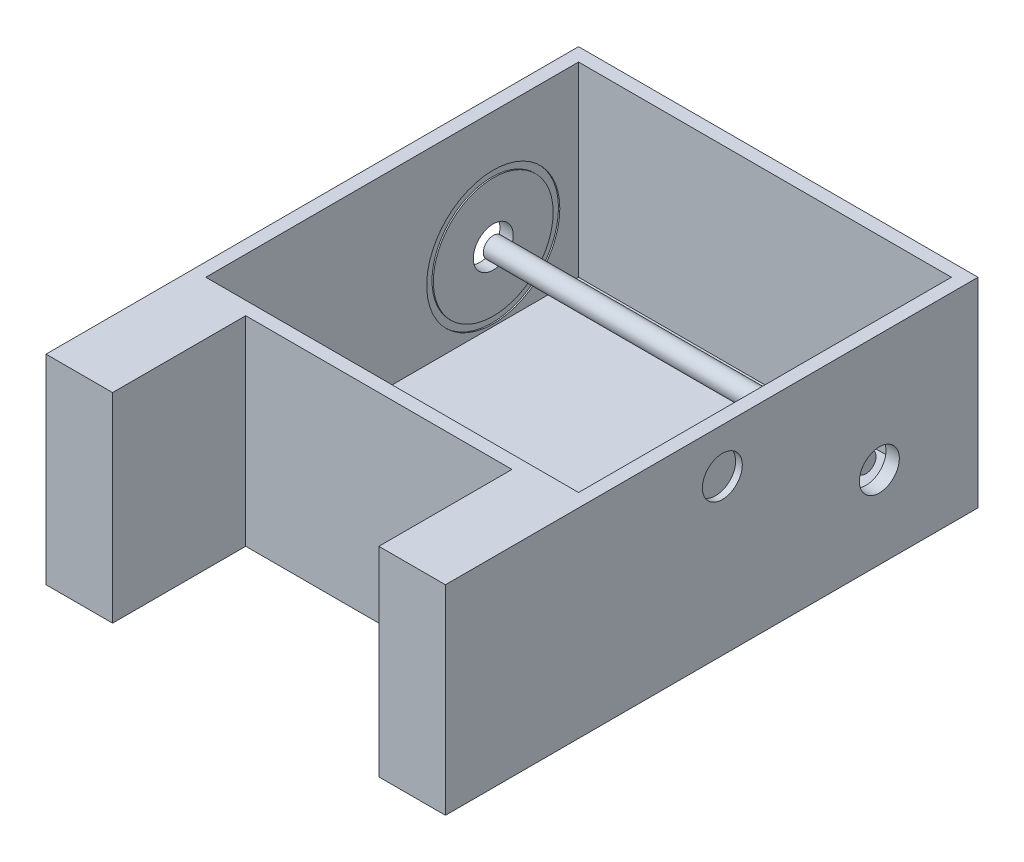
ISO-10303-21;
HEADER;
FILE_DESCRIPTION(('STEP AP214'),'2;1');
FILE_NAME('part.step','',(''),(''),'','','');
FILE_SCHEMA(('AUTOMOTIVE_DESIGN { 1 0 10303 214 1 1 1 1 }'));
ENDSEC;
DATA;
#1=APPLICATION_CONTEXT('core data for automotive mechanical design processes');
#2=APPLICATION_PROTOCOL_DEFINITION('international standard','automotive_design',2000,#1);
#3=PRODUCT_CONTEXT('',#1,'mechanical');
#4=PRODUCT('Part','Part','',(#3));
#5=PRODUCT_RELATED_PRODUCT_CATEGORY('part','',(#4));
#6=PRODUCT_DEFINITION_FORMATION('','',#4);
#7=PRODUCT_DEFINITION_CONTEXT('part definition',#1,'design');
#8=PRODUCT_DEFINITION('design','',#6,#7);
#9=PRODUCT_DEFINITION_SHAPE('','',#8);
#10=(LENGTH_UNIT() NAMED_UNIT(*) SI_UNIT(.MILLI.,.METRE.));
#11=(NAMED_UNIT(*) PLANE_ANGLE_UNIT() SI_UNIT($,.RADIAN.));
#12=(NAMED_UNIT(*) SI_UNIT($,.STERADIAN.) SOLID_ANGLE_UNIT());
#13=UNCERTAINTY_MEASURE_WITH_UNIT(LENGTH_MEASURE(1.E-05),#10,'distance_accuracy_value','');
#14=(GEOMETRIC_REPRESENTATION_CONTEXT(3) GLOBAL_UNCERTAINTY_ASSIGNED_CONTEXT((#13)) GLOBAL_UNIT_ASSIGNED_CONTEXT((#10,
#11,#12)) REPRESENTATION_CONTEXT('',''));
#15=CARTESIAN_POINT('',(0.,0.,0.));
#16=DIRECTION('',(0.,0.,1.));
#17=DIRECTION('',(1.,0.,0.));
#18=AXIS2_PLACEMENT_3D('',#15,#16,#17);
#19=CARTESIAN_POINT('',(140.,-13.2577840170061,74.0855654916692));
#20=DIRECTION('',(-1.,0.,0.));
#21=DIRECTION('',(0.,0.,1.));
#22=AXIS2_PLACEMENT_3D('',#19,#20,#21);
#23=CYLINDRICAL_SURFACE('',#22,7.50000000000001);
#24=CARTESIAN_POINT('',(140.,-13.2577840170061,74.0855654916692));
#25=DIRECTION('',(1.,0.,0.));
#26=DIRECTION('',(0.,0.,-1.));
#27=AXIS2_PLACEMENT_3D('',#24,#25,#26);
#28=CIRCLE('',#27,7.50000000000001);
#29=CARTESIAN_POINT('',(140.,-13.2577840170061,66.5855654916692));
#30=VERTEX_POINT('',#29);
#31=EDGE_CURVE('E11',#30,#30,#28,.T.);
#32=ORIENTED_EDGE('',*,*,#31,.F.);
#33=EDGE_LOOP('',(#32));
#34=FACE_BOUND('',#33,.T.);
#35=CARTESIAN_POINT('',(-140.,-13.2577840170061,74.0855654916692));
#36=DIRECTION('',(1.,0.,0.));
#37=DIRECTION('',(0.,0.,-1.));
#38=AXIS2_PLACEMENT_3D('',#35,#36,#37);
#39=CIRCLE('',#38,7.50000000000001);
#40=CARTESIAN_POINT('',(-140.,-13.2577840170061,66.5855654916692));
#41=VERTEX_POINT('',#40);
#42=EDGE_CURVE('E50',#41,#41,#39,.T.);
#43=ORIENTED_EDGE('',*,*,#42,.T.);
#44=EDGE_LOOP('',(#43));
#45=FACE_BOUND('',#44,.T.);
#46=ADVANCED_FACE('F47',(#34,#45),#23,.T.);
#47=CARTESIAN_POINT('',(140.,-13.2577840170061,74.0855654916692));
#48=DIRECTION('',(1.,0.,0.));
#49=DIRECTION('',(0.,0.,-1.));
#50=AXIS2_PLACEMENT_3D('',#47,#48,#49);
#51=PLANE('',#50);
#52=ORIENTED_EDGE('',*,*,#31,.T.);
#53=EDGE_LOOP('',(#52));
#54=FACE_BOUND('',#53,.T.);
#55=ADVANCED_FACE('F62',(#54),#51,.T.);
#56=CARTESIAN_POINT('',(-140.,-13.2577840170061,74.0855654916692));
#57=DIRECTION('',(1.,0.,0.));
#58=DIRECTION('',(0.,0.,-1.));
#59=AXIS2_PLACEMENT_3D('',#56,#57,#58);
#60=PLANE('',#59);
#61=ORIENTED_EDGE('',*,*,#42,.F.);
#62=EDGE_LOOP('',(#61));
#63=FACE_BOUND('',#62,.T.);
#64=ADVANCED_FACE('F60',(#63),#60,.F.);
#65=CLOSED_SHELL('',(#46,#55,#64));
#66=MANIFOLD_SOLID_BREP('B2',#65);
#67=CARTESIAN_POINT('',(0.,0.,300.));
#68=DIRECTION('',(0.,0.,-1.));
#69=DIRECTION('',(-1.,0.,0.));
#70=AXIS2_PLACEMENT_3D('',#67,#68,#69);
#71=PLANE('',#70);
#72=DIRECTION('',(0.,-1.,0.));
#73=VECTOR('',#72,1.);
#74=CARTESIAN_POINT('',(100.,75.,300.));
#75=LINE('',#74,#73);
#76=CARTESIAN_POINT('',(100.,75.,300.));
#77=VERTEX_POINT('',#76);
#78=CARTESIAN_POINT('',(100.,-75.,300.));
#79=VERTEX_POINT('',#78);
#80=EDGE_CURVE('E113',#77,#79,#75,.T.);
#81=ORIENTED_EDGE('',*,*,#80,.F.);
#82=DIRECTION('',(-1.,0.,0.));
#83=VECTOR('',#82,1.);
#84=CARTESIAN_POINT('',(-150.,75.,300.));
#85=LINE('',#84,#83);
#86=CARTESIAN_POINT('',(-100.,75.,300.));
#87=VERTEX_POINT('',#86);
#88=EDGE_CURVE('E293',#77,#87,#85,.T.);
#89=ORIENTED_EDGE('',*,*,#88,.T.);
#90=DIRECTION('',(0.,1.,0.));
#91=VECTOR('',#90,1.);
#92=CARTESIAN_POINT('',(-100.,75.,300.));
#93=LINE('',#92,#91);
#94=CARTESIAN_POINT('',(-99.9999999999999,-75.,300.));
#95=VERTEX_POINT('',#94);
#96=EDGE_CURVE('E211',#95,#87,#93,.T.);
#97=ORIENTED_EDGE('',*,*,#96,.F.);
#98=DIRECTION('',(1.,0.,0.));
#99=VECTOR('',#98,1.);
#100=CARTESIAN_POINT('',(-150.,-75.,300.));
#101=LINE('',#100,#99);
#102=EDGE_CURVE('E118',#95,#79,#101,.T.);
#103=ORIENTED_EDGE('',*,*,#102,.T.);
#104=EDGE_LOOP('',(#81,#89,#97,#103));
#105=FACE_BOUND('',#104,.T.);
#106=ADVANCED_FACE('F96',(#105),#71,.F.);
#107=CARTESIAN_POINT('',(-150.,75.,300.));
#108=DIRECTION('',(0.,-1.,0.));
#109=DIRECTION('',(0.,0.,-1.));
#110=AXIS2_PLACEMENT_3D('',#107,#108,#109);
#111=PLANE('',#110);
#112=DIRECTION('',(-1.,0.,0.));
#113=VECTOR('',#112,1.);
#114=CARTESIAN_POINT('',(-150.,75.,0.));
#115=LINE('',#114,#113);
#116=CARTESIAN_POINT('',(150.,75.,0.));
#117=VERTEX_POINT('',#116);
#118=CARTESIAN_POINT('',(-150.,75.,0.));
#119=VERTEX_POINT('',#118);
#120=EDGE_CURVE('E297',#117,#119,#115,.T.);
#121=ORIENTED_EDGE('',*,*,#120,.T.);
#122=DIRECTION('',(0.,0.,-1.));
#123=VECTOR('',#122,1.);
#124=CARTESIAN_POINT('',(-150.,75.,300.));
#125=LINE('',#124,#123);
#126=CARTESIAN_POINT('',(-150.,75.,400.));
#127=VERTEX_POINT('',#126);
#128=EDGE_CURVE('E105',#127,#119,#125,.T.);
#129=ORIENTED_EDGE('',*,*,#128,.F.);
#130=DIRECTION('',(-1.,0.,0.));
#131=VECTOR('',#130,1.);
#132=CARTESIAN_POINT('',(-150.,75.,400.));
#133=LINE('',#132,#131);
#134=CARTESIAN_POINT('',(-100.,75.,400.));
#135=VERTEX_POINT('',#134);
#136=EDGE_CURVE('E223',#135,#127,#133,.T.);
#137=ORIENTED_EDGE('',*,*,#136,.F.);
#138=DIRECTION('',(0.,0.,-1.));
#139=VECTOR('',#138,1.);
#140=CARTESIAN_POINT('',(-100.,75.,400.));
#141=LINE('',#140,#139);
#142=EDGE_CURVE('E226',#135,#87,#141,.T.);
#143=ORIENTED_EDGE('',*,*,#142,.T.);
#144=ORIENTED_EDGE('',*,*,#88,.F.);
#145=DIRECTION('',(0.,0.,-1.));
#146=VECTOR('',#145,1.);
#147=CARTESIAN_POINT('',(100.,75.,400.));
#148=LINE('',#147,#146);
#149=CARTESIAN_POINT('',(100.,75.,400.));
#150=VERTEX_POINT('',#149);
#151=EDGE_CURVE('E366',#150,#77,#148,.T.);
#152=ORIENTED_EDGE('',*,*,#151,.F.);
#153=DIRECTION('',(-1.,0.,0.));
#154=VECTOR('',#153,1.);
#155=CARTESIAN_POINT('',(150.,75.,400.));
#156=LINE('',#155,#154);
#157=CARTESIAN_POINT('',(150.,75.,400.));
#158=VERTEX_POINT('',#157);
#159=EDGE_CURVE('E209',#158,#150,#156,.T.);
#160=ORIENTED_EDGE('',*,*,#159,.F.);
#161=DIRECTION('',(0.,0.,-1.));
#162=VECTOR('',#161,1.);
#163=CARTESIAN_POINT('',(150.,75.,300.));
#164=LINE('',#163,#162);
#165=EDGE_CURVE('E45',#158,#117,#164,.T.);
#166=ORIENTED_EDGE('',*,*,#165,.T.);
#167=EDGE_LOOP('',(#121,#129,#137,#143,#144,#152,#160,#166));
#168=FACE_BOUND('',#167,.T.);
#169=DIRECTION('',(-1.,0.,0.));
#170=VECTOR('',#169,1.);
#171=CARTESIAN_POINT('',(0.,75.,10.));
#172=LINE('',#171,#170);
#173=CARTESIAN_POINT('',(140.,75.,10.));
#174=VERTEX_POINT('',#173);
#175=CARTESIAN_POINT('',(-140.,75.,10.));
#176=VERTEX_POINT('',#175);
#177=EDGE_CURVE('E266',#174,#176,#172,.T.);
#178=ORIENTED_EDGE('',*,*,#177,.F.);
#179=DIRECTION('',(0.,0.,-1.));
#180=VECTOR('',#179,1.);
#181=CARTESIAN_POINT('',(140.,75.,300.));
#182=LINE('',#181,#180);
#183=CARTESIAN_POINT('',(140.,75.,290.));
#184=VERTEX_POINT('',#183);
#185=EDGE_CURVE('E285',#184,#174,#182,.T.);
#186=ORIENTED_EDGE('',*,*,#185,.F.);
#187=DIRECTION('',(-1.,0.,0.));
#188=VECTOR('',#187,1.);
#189=CARTESIAN_POINT('',(0.,75.,290.));
#190=LINE('',#189,#188);
#191=CARTESIAN_POINT('',(-140.,75.,290.));
#192=VERTEX_POINT('',#191);
#193=EDGE_CURVE('E269',#184,#192,#190,.T.);
#194=ORIENTED_EDGE('',*,*,#193,.T.);
#195=DIRECTION('',(0.,0.,-1.));
#196=VECTOR('',#195,1.);
#197=CARTESIAN_POINT('',(-140.,75.,300.));
#198=LINE('',#197,#196);
#199=EDGE_CURVE('E282',#192,#176,#198,.T.);
#200=ORIENTED_EDGE('',*,*,#199,.T.);
#201=EDGE_LOOP('',(#178,#186,#194,#200));
#202=FACE_BOUND('',#201,.T.);
#203=ADVANCED_FACE('F334',(#168,#202),#111,.F.);
#204=CARTESIAN_POINT('',(150.,-75.,300.));
#205=DIRECTION('',(-1.,0.,0.));
#206=DIRECTION('',(0.,0.,1.));
#207=AXIS2_PLACEMENT_3D('',#204,#205,#206);
#208=PLANE('',#207);
#209=CARTESIAN_POINT('',(150.,41.4548623562041,192.016194132933));
#210=DIRECTION('',(1.,0.,0.));
#211=DIRECTION('',(0.,0.,-1.));
#212=AXIS2_PLACEMENT_3D('',#209,#210,#211);
#213=CIRCLE('',#212,15.);
#214=CARTESIAN_POINT('',(150.,41.4548623562041,177.016194132933));
#215=VERTEX_POINT('',#214);
#216=EDGE_CURVE('E373',#215,#215,#213,.T.);
#217=ORIENTED_EDGE('',*,*,#216,.F.);
#218=EDGE_LOOP('',(#217));
#219=FACE_BOUND('',#218,.T.);
#220=CARTESIAN_POINT('',(150.,-13.2577840170061,74.0855654916692));
#221=DIRECTION('',(-1.,0.,0.));
#222=DIRECTION('',(0.,0.,1.));
#223=AXIS2_PLACEMENT_3D('',#220,#221,#222);
#224=CIRCLE('',#223,15.);
#225=CARTESIAN_POINT('',(150.,-13.2577840170061,89.0855654916692));
#226=VERTEX_POINT('',#225);
#227=EDGE_CURVE('E240',#226,#226,#224,.F.);
#228=ORIENTED_EDGE('',*,*,#227,.F.);
#229=EDGE_LOOP('',(#228));
#230=FACE_BOUND('',#229,.T.);
#231=DIRECTION('',(0.,1.,0.));
#232=VECTOR('',#231,1.);
#233=CARTESIAN_POINT('',(150.,-75.,0.));
#234=LINE('',#233,#232);
#235=CARTESIAN_POINT('',(150.,-75.,0.));
#236=VERTEX_POINT('',#235);
#237=EDGE_CURVE('E287',#236,#117,#234,.T.);
#238=ORIENTED_EDGE('',*,*,#237,.T.);
#239=ORIENTED_EDGE('',*,*,#165,.F.);
#240=DIRECTION('',(0.,1.,0.));
#241=VECTOR('',#240,1.);
#242=CARTESIAN_POINT('',(150.,75.,400.));
#243=LINE('',#242,#241);
#244=CARTESIAN_POINT('',(150.,-75.,400.));
#245=VERTEX_POINT('',#244);
#246=EDGE_CURVE('E202',#245,#158,#243,.T.);
#247=ORIENTED_EDGE('',*,*,#246,.F.);
#248=DIRECTION('',(0.,0.,-1.));
#249=VECTOR('',#248,1.);
#250=CARTESIAN_POINT('',(150.,-75.,300.));
#251=LINE('',#250,#249);
#252=EDGE_CURVE('E185',#245,#236,#251,.T.);
#253=ORIENTED_EDGE('',*,*,#252,.T.);
#254=EDGE_LOOP('',(#238,#239,#247,#253));
#255=FACE_BOUND('',#254,.T.);
#256=ADVANCED_FACE('F98',(#219,#230,#255),#208,.F.);
#257=CARTESIAN_POINT('',(-150.,-75.,300.));
#258=DIRECTION('',(1.,0.,0.));
#259=DIRECTION('',(0.,0.,-1.));
#260=AXIS2_PLACEMENT_3D('',#257,#258,#259);
#261=PLANE('',#260);
#262=CARTESIAN_POINT('',(-150.,-13.2577840170061,74.0855654916692));
#263=DIRECTION('',(1.,0.,0.));
#264=DIRECTION('',(0.,0.,-1.));
#265=AXIS2_PLACEMENT_3D('',#262,#263,#264);
#266=CIRCLE('',#265,15.);
#267=CARTESIAN_POINT('',(-150.,-13.2577840170061,59.0855654916692));
#268=VERTEX_POINT('',#267);
#269=EDGE_CURVE('E237',#268,#268,#266,.F.);
#270=ORIENTED_EDGE('',*,*,#269,.F.);
#271=EDGE_LOOP('',(#270));
#272=FACE_BOUND('',#271,.T.);
#273=DIRECTION('',(0.,-1.,0.));
#274=VECTOR('',#273,1.);
#275=CARTESIAN_POINT('',(-150.,-75.,0.));
#276=LINE('',#275,#274);
#277=CARTESIAN_POINT('',(-150.,-75.,0.));
#278=VERTEX_POINT('',#277);
#279=EDGE_CURVE('E299',#119,#278,#276,.T.);
#280=ORIENTED_EDGE('',*,*,#279,.T.);
#281=DIRECTION('',(0.,0.,-1.));
#282=VECTOR('',#281,1.);
#283=CARTESIAN_POINT('',(-150.,-75.,300.));
#284=LINE('',#283,#282);
#285=CARTESIAN_POINT('',(-150.,-75.,400.));
#286=VERTEX_POINT('',#285);
#287=EDGE_CURVE('E197',#286,#278,#284,.T.);
#288=ORIENTED_EDGE('',*,*,#287,.F.);
#289=DIRECTION('',(0.,-1.,0.));
#290=VECTOR('',#289,1.);
#291=CARTESIAN_POINT('',(-150.,75.,400.));
#292=LINE('',#291,#290);
#293=EDGE_CURVE('E216',#127,#286,#292,.T.);
#294=ORIENTED_EDGE('',*,*,#293,.F.);
#295=ORIENTED_EDGE('',*,*,#128,.T.);
#296=EDGE_LOOP('',(#280,#288,#294,#295));
#297=FACE_BOUND('',#296,.T.);
#298=ADVANCED_FACE('F350',(#272,#297),#261,.F.);
#299=CARTESIAN_POINT('',(-150.,-75.,300.));
#300=DIRECTION('',(0.,1.,0.));
#301=DIRECTION('',(0.,0.,1.));
#302=AXIS2_PLACEMENT_3D('',#299,#300,#301);
#303=PLANE('',#302);
#304=DIRECTION('',(1.,0.,0.));
#305=VECTOR('',#304,1.);
#306=CARTESIAN_POINT('',(-150.,-75.,0.));
#307=LINE('',#306,#305);
#308=EDGE_CURVE('E192',#278,#236,#307,.T.);
#309=ORIENTED_EDGE('',*,*,#308,.T.);
#310=ORIENTED_EDGE('',*,*,#252,.F.);
#311=DIRECTION('',(1.,0.,0.));
#312=VECTOR('',#311,1.);
#313=CARTESIAN_POINT('',(150.,-75.,400.));
#314=LINE('',#313,#312);
#315=CARTESIAN_POINT('',(100.,-75.,400.));
#316=VERTEX_POINT('',#315);
#317=EDGE_CURVE('E189',#316,#245,#314,.T.);
#318=ORIENTED_EDGE('',*,*,#317,.F.);
#319=DIRECTION('',(0.,0.,-1.));
#320=VECTOR('',#319,1.);
#321=CARTESIAN_POINT('',(100.,-75.,400.));
#322=LINE('',#321,#320);
#323=EDGE_CURVE('E206',#316,#79,#322,.T.);
#324=ORIENTED_EDGE('',*,*,#323,.T.);
#325=ORIENTED_EDGE('',*,*,#102,.F.);
#326=DIRECTION('',(0.,0.,-1.));
#327=VECTOR('',#326,1.);
#328=CARTESIAN_POINT('',(-99.9999999999999,-75.,400.));
#329=LINE('',#328,#327);
#330=CARTESIAN_POINT('',(-99.9999999999999,-75.,400.));
#331=VERTEX_POINT('',#330);
#332=EDGE_CURVE('E231',#331,#95,#329,.T.);
#333=ORIENTED_EDGE('',*,*,#332,.F.);
#334=DIRECTION('',(1.,0.,0.));
#335=VECTOR('',#334,1.);
#336=CARTESIAN_POINT('',(-150.,-75.,400.));
#337=LINE('',#336,#335);
#338=EDGE_CURVE('E219',#286,#331,#337,.T.);
#339=ORIENTED_EDGE('',*,*,#338,.F.);
#340=ORIENTED_EDGE('',*,*,#287,.T.);
#341=EDGE_LOOP('',(#309,#310,#318,#324,#325,#333,#339,#340));
#342=FACE_BOUND('',#341,.T.);
#343=ADVANCED_FACE('F187',(#342),#303,.F.);
#344=CARTESIAN_POINT('',(0.,0.,0.));
#345=DIRECTION('',(0.,0.,-1.));
#346=DIRECTION('',(-1.,0.,0.));
#347=AXIS2_PLACEMENT_3D('',#344,#345,#346);
#348=PLANE('',#347);
#349=ORIENTED_EDGE('',*,*,#237,.F.);
#350=ORIENTED_EDGE('',*,*,#308,.F.);
#351=ORIENTED_EDGE('',*,*,#279,.F.);
#352=ORIENTED_EDGE('',*,*,#120,.F.);
#353=EDGE_LOOP('',(#349,#350,#351,#352));
#354=FACE_BOUND('',#353,.T.);
#355=ADVANCED_FACE('F343',(#354),#348,.T.);
#356=CARTESIAN_POINT('',(140.,-75.,300.));
#357=DIRECTION('',(-1.,0.,0.));
#358=DIRECTION('',(0.,0.,1.));
#359=AXIS2_PLACEMENT_3D('',#356,#357,#358);
#360=PLANE('',#359);
#361=CARTESIAN_POINT('',(140.,-13.2577840170061,74.0855654916692));
#362=DIRECTION('',(-1.,0.,0.));
#363=DIRECTION('',(0.,0.,1.));
#364=AXIS2_PLACEMENT_3D('',#361,#362,#363);
#365=CIRCLE('',#364,50.);
#366=CARTESIAN_POINT('',(140.,-13.2577840170061,124.085565491669));
#367=VERTEX_POINT('',#366);
#368=EDGE_CURVE('E260',#367,#367,#365,.F.);
#369=ORIENTED_EDGE('',*,*,#368,.T.);
#370=EDGE_LOOP('',(#369));
#371=FACE_BOUND('',#370,.T.);
#372=DIRECTION('',(0.,1.,0.));
#373=VECTOR('',#372,1.);
#374=CARTESIAN_POINT('',(140.,0.,10.));
#375=LINE('',#374,#373);
#376=CARTESIAN_POINT('',(140.,-65.,10.));
#377=VERTEX_POINT('',#376);
#378=EDGE_CURVE('E263',#377,#174,#375,.T.);
#379=ORIENTED_EDGE('',*,*,#378,.F.);
#380=DIRECTION('',(0.,0.,-1.));
#381=VECTOR('',#380,1.);
#382=CARTESIAN_POINT('',(140.,-65.,300.));
#383=LINE('',#382,#381);
#384=CARTESIAN_POINT('',(140.,-65.,290.));
#385=VERTEX_POINT('',#384);
#386=EDGE_CURVE('E271',#385,#377,#383,.T.);
#387=ORIENTED_EDGE('',*,*,#386,.F.);
#388=DIRECTION('',(0.,1.,0.));
#389=VECTOR('',#388,1.);
#390=CARTESIAN_POINT('',(140.,0.,290.));
#391=LINE('',#390,#389);
#392=EDGE_CURVE('E267',#385,#184,#391,.T.);
#393=ORIENTED_EDGE('',*,*,#392,.T.);
#394=ORIENTED_EDGE('',*,*,#185,.T.);
#395=EDGE_LOOP('',(#379,#387,#393,#394));
#396=FACE_BOUND('',#395,.T.);
#397=ADVANCED_FACE('F346',(#371,#396),#360,.T.);
#398=CARTESIAN_POINT('',(-140.,-75.,300.));
#399=DIRECTION('',(1.,0.,0.));
#400=DIRECTION('',(0.,0.,-1.));
#401=AXIS2_PLACEMENT_3D('',#398,#399,#400);
#402=PLANE('',#401);
#403=CARTESIAN_POINT('',(-140.,-13.2577840170061,74.0855654916692));
#404=DIRECTION('',(1.,0.,0.));
#405=DIRECTION('',(0.,0.,-1.));
#406=AXIS2_PLACEMENT_3D('',#403,#404,#405);
#407=CIRCLE('',#406,50.);
#408=CARTESIAN_POINT('',(-140.,-13.2577840170061,24.0855654916692));
#409=VERTEX_POINT('',#408);
#410=EDGE_CURVE('E259',#409,#409,#407,.F.);
#411=ORIENTED_EDGE('',*,*,#410,.T.);
#412=EDGE_LOOP('',(#411));
#413=FACE_BOUND('',#412,.T.);
#414=DIRECTION('',(0.,-1.,0.));
#415=VECTOR('',#414,1.);
#416=CARTESIAN_POINT('',(-140.,0.,10.));
#417=LINE('',#416,#415);
#418=CARTESIAN_POINT('',(-140.,-65.,10.));
#419=VERTEX_POINT('',#418);
#420=EDGE_CURVE('E277',#176,#419,#417,.T.);
#421=ORIENTED_EDGE('',*,*,#420,.F.);
#422=ORIENTED_EDGE('',*,*,#199,.F.);
#423=DIRECTION('',(0.,-1.,0.));
#424=VECTOR('',#423,1.);
#425=CARTESIAN_POINT('',(-140.,0.,290.));
#426=LINE('',#425,#424);
#427=CARTESIAN_POINT('',(-140.,-65.,290.));
#428=VERTEX_POINT('',#427);
#429=EDGE_CURVE('E279',#192,#428,#426,.T.);
#430=ORIENTED_EDGE('',*,*,#429,.T.);
#431=DIRECTION('',(0.,0.,-1.));
#432=VECTOR('',#431,1.);
#433=CARTESIAN_POINT('',(-140.,-65.,300.));
#434=LINE('',#433,#432);
#435=EDGE_CURVE('E274',#428,#419,#434,.T.);
#436=ORIENTED_EDGE('',*,*,#435,.T.);
#437=EDGE_LOOP('',(#421,#422,#430,#436));
#438=FACE_BOUND('',#437,.T.);
#439=ADVANCED_FACE('F309',(#413,#438),#402,.T.);
#440=CARTESIAN_POINT('',(-150.,-65.,300.));
#441=DIRECTION('',(0.,1.,0.));
#442=DIRECTION('',(0.,0.,1.));
#443=AXIS2_PLACEMENT_3D('',#440,#441,#442);
#444=PLANE('',#443);
#445=DIRECTION('',(1.,0.,0.));
#446=VECTOR('',#445,1.);
#447=CARTESIAN_POINT('',(0.,-65.,10.));
#448=LINE('',#447,#446);
#449=EDGE_CURVE('E270',#419,#377,#448,.T.);
#450=ORIENTED_EDGE('',*,*,#449,.F.);
#451=ORIENTED_EDGE('',*,*,#435,.F.);
#452=DIRECTION('',(1.,0.,0.));
#453=VECTOR('',#452,1.);
#454=CARTESIAN_POINT('',(0.,-65.,290.));
#455=LINE('',#454,#453);
#456=EDGE_CURVE('E275',#428,#385,#455,.T.);
#457=ORIENTED_EDGE('',*,*,#456,.T.);
#458=ORIENTED_EDGE('',*,*,#386,.T.);
#459=EDGE_LOOP('',(#450,#451,#457,#458));
#460=FACE_BOUND('',#459,.T.);
#461=ADVANCED_FACE('F493',(#460),#444,.T.);
#462=CARTESIAN_POINT('',(0.,0.,290.));
#463=DIRECTION('',(0.,0.,-1.));
#464=DIRECTION('',(-1.,0.,0.));
#465=AXIS2_PLACEMENT_3D('',#462,#463,#464);
#466=PLANE('',#465);
#467=ORIENTED_EDGE('',*,*,#392,.F.);
#468=ORIENTED_EDGE('',*,*,#456,.F.);
#469=ORIENTED_EDGE('',*,*,#429,.F.);
#470=ORIENTED_EDGE('',*,*,#193,.F.);
#471=EDGE_LOOP('',(#467,#468,#469,#470));
#472=FACE_BOUND('',#471,.T.);
#473=ADVANCED_FACE('F500',(#472),#466,.T.);
#474=CARTESIAN_POINT('',(0.,0.,10.));
#475=DIRECTION('',(0.,0.,-1.));
#476=DIRECTION('',(-1.,0.,0.));
#477=AXIS2_PLACEMENT_3D('',#474,#475,#476);
#478=PLANE('',#477);
#479=ORIENTED_EDGE('',*,*,#378,.T.);
#480=ORIENTED_EDGE('',*,*,#177,.T.);
#481=ORIENTED_EDGE('',*,*,#420,.T.);
#482=ORIENTED_EDGE('',*,*,#449,.T.);
#483=EDGE_LOOP('',(#479,#480,#481,#482));
#484=FACE_BOUND('',#483,.T.);
#485=ADVANCED_FACE('F316',(#484),#478,.F.);
#486=CARTESIAN_POINT('',(144.,-13.2577840170061,74.0855654916692));
#487=DIRECTION('',(-1.,0.,0.));
#488=DIRECTION('',(0.,0.,1.));
#489=AXIS2_PLACEMENT_3D('',#486,#487,#488);
#490=CYLINDRICAL_SURFACE('',#489,50.);
#491=ORIENTED_EDGE('',*,*,#410,.F.);
#492=EDGE_LOOP('',(#491));
#493=FACE_BOUND('',#492,.T.);
#494=CARTESIAN_POINT('',(-141.,-13.2577840170061,74.0855654916692));
#495=DIRECTION('',(1.,0.,0.));
#496=DIRECTION('',(0.,0.,-1.));
#497=AXIS2_PLACEMENT_3D('',#494,#495,#496);
#498=CIRCLE('',#497,50.);
#499=CARTESIAN_POINT('',(-141.,-13.2577840170061,24.0855654916692));
#500=VERTEX_POINT('',#499);
#501=EDGE_CURVE('E246',#500,#500,#498,.T.);
#502=ORIENTED_EDGE('',*,*,#501,.F.);
#503=EDGE_LOOP('',(#502));
#504=FACE_BOUND('',#503,.T.);
#505=ADVANCED_FACE('F312',(#493,#504),#490,.F.);
#506=CARTESIAN_POINT('',(-141.,-13.2577840170061,74.0855654916692));
#507=DIRECTION('',(1.,0.,0.));
#508=DIRECTION('',(0.,0.,-1.));
#509=AXIS2_PLACEMENT_3D('',#506,#507,#508);
#510=PLANE('',#509);
#511=CARTESIAN_POINT('',(-141.,-13.2577840170061,74.0855654916692));
#512=DIRECTION('',(1.,0.,0.));
#513=DIRECTION('',(0.,0.,-1.));
#514=AXIS2_PLACEMENT_3D('',#511,#512,#513);
#515=CIRCLE('',#514,45.);
#516=CARTESIAN_POINT('',(-141.,-13.2577840170061,29.0855654916692));
#517=VERTEX_POINT('',#516);
#518=EDGE_CURVE('E243',#517,#517,#515,.T.);
#519=ORIENTED_EDGE('',*,*,#518,.F.);
#520=EDGE_LOOP('',(#519));
#521=FACE_BOUND('',#520,.T.);
#522=ORIENTED_EDGE('',*,*,#501,.T.);
#523=EDGE_LOOP('',(#522));
#524=FACE_BOUND('',#523,.T.);
#525=ADVANCED_FACE('F315',(#521,#524),#510,.T.);
#526=CARTESIAN_POINT('',(144.,-13.2577840170061,74.0855654916692));
#527=DIRECTION('',(-1.,0.,0.));
#528=DIRECTION('',(0.,0.,1.));
#529=AXIS2_PLACEMENT_3D('',#526,#527,#528);
#530=CYLINDRICAL_SURFACE('',#529,45.);
#531=CARTESIAN_POINT('',(-140.,-13.2577840170061,74.0855654916692));
#532=DIRECTION('',(1.,0.,0.));
#533=DIRECTION('',(0.,0.,-1.));
#534=AXIS2_PLACEMENT_3D('',#531,#532,#533);
#535=CIRCLE('',#534,45.);
#536=CARTESIAN_POINT('',(-140.,-13.2577840170061,29.0855654916692));
#537=VERTEX_POINT('',#536);
#538=EDGE_CURVE('E255',#537,#537,#535,.F.);
#539=ORIENTED_EDGE('',*,*,#538,.T.);
#540=EDGE_LOOP('',(#539));
#541=FACE_BOUND('',#540,.T.);
#542=ORIENTED_EDGE('',*,*,#518,.T.);
#543=EDGE_LOOP('',(#542));
#544=FACE_BOUND('',#543,.T.);
#545=ADVANCED_FACE('F322',(#541,#544),#530,.T.);
#546=ORIENTED_EDGE('',*,*,#368,.F.);
#547=EDGE_LOOP('',(#546));
#548=FACE_BOUND('',#547,.T.);
#549=CARTESIAN_POINT('',(144.,-13.2577840170061,74.0855654916692));
#550=DIRECTION('',(1.,0.,0.));
#551=DIRECTION('',(0.,0.,-1.));
#552=AXIS2_PLACEMENT_3D('',#549,#550,#551);
#553=CIRCLE('',#552,50.);
#554=CARTESIAN_POINT('',(144.,-13.2577840170061,24.0855654916692));
#555=VERTEX_POINT('',#554);
#556=EDGE_CURVE('E252',#555,#555,#553,.T.);
#557=ORIENTED_EDGE('',*,*,#556,.T.);
#558=EDGE_LOOP('',(#557));
#559=FACE_BOUND('',#558,.T.);
#560=ADVANCED_FACE('F318',(#548,#559),#490,.F.);
#561=CARTESIAN_POINT('',(140.,-13.2577840170061,74.0855654916692));
#562=DIRECTION('',(-1.,0.,0.));
#563=DIRECTION('',(0.,0.,1.));
#564=AXIS2_PLACEMENT_3D('',#561,#562,#563);
#565=CIRCLE('',#564,45.);
#566=CARTESIAN_POINT('',(140.,-13.2577840170061,119.085565491669));
#567=VERTEX_POINT('',#566);
#568=EDGE_CURVE('E256',#567,#567,#565,.F.);
#569=ORIENTED_EDGE('',*,*,#568,.T.);
#570=EDGE_LOOP('',(#569));
#571=FACE_BOUND('',#570,.T.);
#572=CARTESIAN_POINT('',(144.,-13.2577840170061,74.0855654916692));
#573=DIRECTION('',(1.,0.,0.));
#574=DIRECTION('',(0.,0.,-1.));
#575=AXIS2_PLACEMENT_3D('',#572,#573,#574);
#576=CIRCLE('',#575,45.);
#577=CARTESIAN_POINT('',(144.,-13.2577840170061,29.0855654916692));
#578=VERTEX_POINT('',#577);
#579=EDGE_CURVE('E249',#578,#578,#576,.T.);
#580=ORIENTED_EDGE('',*,*,#579,.F.);
#581=EDGE_LOOP('',(#580));
#582=FACE_BOUND('',#581,.T.);
#583=ADVANCED_FACE('F330',(#571,#582),#530,.T.);
#584=CARTESIAN_POINT('',(144.,-13.2577840170061,74.0855654916692));
#585=DIRECTION('',(1.,0.,0.));
#586=DIRECTION('',(0.,0.,-1.));
#587=AXIS2_PLACEMENT_3D('',#584,#585,#586);
#588=PLANE('',#587);
#589=ORIENTED_EDGE('',*,*,#556,.F.);
#590=EDGE_LOOP('',(#589));
#591=FACE_BOUND('',#590,.T.);
#592=ORIENTED_EDGE('',*,*,#579,.T.);
#593=EDGE_LOOP('',(#592));
#594=FACE_BOUND('',#593,.T.);
#595=ADVANCED_FACE('F548',(#591,#594),#588,.F.);
#596=CARTESIAN_POINT('',(-140.,-13.2577840170061,74.0855654916692));
#597=DIRECTION('',(1.,0.,0.));
#598=DIRECTION('',(0.,0.,-1.));
#599=AXIS2_PLACEMENT_3D('',#596,#597,#598);
#600=CIRCLE('',#599,15.);
#601=CARTESIAN_POINT('',(-140.,-13.2577840170061,59.0855654916692));
#602=VERTEX_POINT('',#601);
#603=EDGE_CURVE('E234',#602,#602,#600,.F.);
#604=ORIENTED_EDGE('',*,*,#603,.T.);
#605=EDGE_LOOP('',(#604));
#606=FACE_BOUND('',#605,.T.);
#607=ORIENTED_EDGE('',*,*,#538,.F.);
#608=EDGE_LOOP('',(#607));
#609=FACE_BOUND('',#608,.T.);
#610=ADVANCED_FACE('F400',(#606,#609),#402,.T.);
#611=CARTESIAN_POINT('',(140.,-13.2577840170061,74.0855654916692));
#612=DIRECTION('',(-1.,0.,0.));
#613=DIRECTION('',(0.,0.,1.));
#614=AXIS2_PLACEMENT_3D('',#611,#612,#613);
#615=CIRCLE('',#614,15.);
#616=CARTESIAN_POINT('',(140.,-13.2577840170061,89.0855654916692));
#617=VERTEX_POINT('',#616);
#618=EDGE_CURVE('E100',#617,#617,#615,.F.);
#619=ORIENTED_EDGE('',*,*,#618,.T.);
#620=EDGE_LOOP('',(#619));
#621=FACE_BOUND('',#620,.T.);
#622=ORIENTED_EDGE('',*,*,#568,.F.);
#623=EDGE_LOOP('',(#622));
#624=FACE_BOUND('',#623,.T.);
#625=ADVANCED_FACE('F392',(#621,#624),#360,.T.);
#626=CARTESIAN_POINT('',(221.,-13.2577840170061,74.0855654916692));
#627=DIRECTION('',(-1.,0.,0.));
#628=DIRECTION('',(0.,0.,1.));
#629=AXIS2_PLACEMENT_3D('',#626,#627,#628);
#630=CYLINDRICAL_SURFACE('',#629,15.);
#631=ORIENTED_EDGE('',*,*,#618,.F.);
#632=EDGE_LOOP('',(#631));
#633=FACE_BOUND('',#632,.T.);
#634=ORIENTED_EDGE('',*,*,#227,.T.);
#635=EDGE_LOOP('',(#634));
#636=FACE_BOUND('',#635,.T.);
#637=ADVANCED_FACE('F389',(#633,#636),#630,.F.);
#638=ORIENTED_EDGE('',*,*,#603,.F.);
#639=EDGE_LOOP('',(#638));
#640=FACE_BOUND('',#639,.T.);
#641=ORIENTED_EDGE('',*,*,#269,.T.);
#642=EDGE_LOOP('',(#641));
#643=FACE_BOUND('',#642,.T.);
#644=ADVANCED_FACE('F391',(#640,#643),#630,.F.);
#645=CARTESIAN_POINT('',(-100.,75.,400.));
#646=DIRECTION('',(-1.,0.,0.));
#647=DIRECTION('',(0.,-1.,0.));
#648=AXIS2_PLACEMENT_3D('',#645,#646,#647);
#649=PLANE('',#648);
#650=ORIENTED_EDGE('',*,*,#96,.T.);
#651=ORIENTED_EDGE('',*,*,#142,.F.);
#652=DIRECTION('',(0.,1.,0.));
#653=VECTOR('',#652,1.);
#654=CARTESIAN_POINT('',(-100.,75.,400.));
#655=LINE('',#654,#653);
#656=EDGE_CURVE('E221',#331,#135,#655,.T.);
#657=ORIENTED_EDGE('',*,*,#656,.F.);
#658=ORIENTED_EDGE('',*,*,#332,.T.);
#659=EDGE_LOOP('',(#650,#651,#657,#658));
#660=FACE_BOUND('',#659,.T.);
#661=ADVANCED_FACE('F398',(#660),#649,.F.);
#662=CARTESIAN_POINT('',(0.,0.,400.));
#663=DIRECTION('',(0.,0.,1.));
#664=DIRECTION('',(1.,0.,0.));
#665=AXIS2_PLACEMENT_3D('',#662,#663,#664);
#666=PLANE('',#665);
#667=ORIENTED_EDGE('',*,*,#293,.T.);
#668=ORIENTED_EDGE('',*,*,#338,.T.);
#669=ORIENTED_EDGE('',*,*,#656,.T.);
#670=ORIENTED_EDGE('',*,*,#136,.T.);
#671=EDGE_LOOP('',(#667,#668,#669,#670));
#672=FACE_BOUND('',#671,.T.);
#673=ADVANCED_FACE('F407',(#672),#666,.T.);
#674=CARTESIAN_POINT('',(100.,75.,400.));
#675=DIRECTION('',(1.,0.,0.));
#676=DIRECTION('',(0.,1.,0.));
#677=AXIS2_PLACEMENT_3D('',#674,#675,#676);
#678=PLANE('',#677);
#679=ORIENTED_EDGE('',*,*,#80,.T.);
#680=ORIENTED_EDGE('',*,*,#323,.F.);
#681=DIRECTION('',(0.,-1.,0.));
#682=VECTOR('',#681,1.);
#683=CARTESIAN_POINT('',(100.,75.,400.));
#684=LINE('',#683,#682);
#685=EDGE_CURVE('E204',#150,#316,#684,.T.);
#686=ORIENTED_EDGE('',*,*,#685,.F.);
#687=ORIENTED_EDGE('',*,*,#151,.T.);
#688=EDGE_LOOP('',(#679,#680,#686,#687));
#689=FACE_BOUND('',#688,.T.);
#690=ADVANCED_FACE('F370',(#689),#678,.F.);
#691=CARTESIAN_POINT('',(0.,0.,400.));
#692=DIRECTION('',(0.,0.,-1.));
#693=DIRECTION('',(-1.,0.,0.));
#694=AXIS2_PLACEMENT_3D('',#691,#692,#693);
#695=PLANE('',#694);
#696=ORIENTED_EDGE('',*,*,#246,.T.);
#697=ORIENTED_EDGE('',*,*,#159,.T.);
#698=ORIENTED_EDGE('',*,*,#685,.T.);
#699=ORIENTED_EDGE('',*,*,#317,.T.);
#700=EDGE_LOOP('',(#696,#697,#698,#699));
#701=FACE_BOUND('',#700,.T.);
#702=ADVANCED_FACE('F201',(#701),#695,.F.);
#703=CARTESIAN_POINT('',(145.,41.4548623562041,192.016194132933));
#704=DIRECTION('',(1.,0.,0.));
#705=DIRECTION('',(0.,0.,-1.));
#706=AXIS2_PLACEMENT_3D('',#703,#704,#705);
#707=CYLINDRICAL_SURFACE('',#706,15.);
#708=CARTESIAN_POINT('',(145.,41.4548623562041,192.016194132933));
#709=DIRECTION('',(1.,0.,0.));
#710=DIRECTION('',(0.,0.,-1.));
#711=AXIS2_PLACEMENT_3D('',#708,#709,#710);
#712=CIRCLE('',#711,15.);
#713=CARTESIAN_POINT('',(145.,41.4548623562041,177.016194132933));
#714=VERTEX_POINT('',#713);
#715=EDGE_CURVE('E368',#714,#714,#712,.T.);
#716=ORIENTED_EDGE('',*,*,#715,.F.);
#717=EDGE_LOOP('',(#716));
#718=FACE_BOUND('',#717,.T.);
#719=ORIENTED_EDGE('',*,*,#216,.T.);
#720=EDGE_LOOP('',(#719));
#721=FACE_BOUND('',#720,.T.);
#722=ADVANCED_FACE('F381',(#718,#721),#707,.F.);
#723=CARTESIAN_POINT('',(145.,41.4548623562041,192.016194132933));
#724=DIRECTION('',(1.,0.,0.));
#725=DIRECTION('',(0.,0.,-1.));
#726=AXIS2_PLACEMENT_3D('',#723,#724,#725);
#727=PLANE('',#726);
#728=ORIENTED_EDGE('',*,*,#715,.T.);
#729=EDGE_LOOP('',(#728));
#730=FACE_BOUND('',#729,.T.);
#731=ADVANCED_FACE('F379',(#730),#727,.T.);
#732=CLOSED_SHELL('',(#106,#203,#256,#298,#343,#355,#397,#439,#461,#473,#485,#505,#525,#545,
#560,#583,#595,#610,#625,#637,#644,#661,#673,#690,#702,#722,#731));
#733=MANIFOLD_SOLID_BREP('B6',#732);
#734=ADVANCED_BREP_SHAPE_REPRESENTATION('',(#18,#66,#733),#14);
#735=SHAPE_DEFINITION_REPRESENTATION(#9,#734);
ENDSEC;
END-ISO-10303-21;
